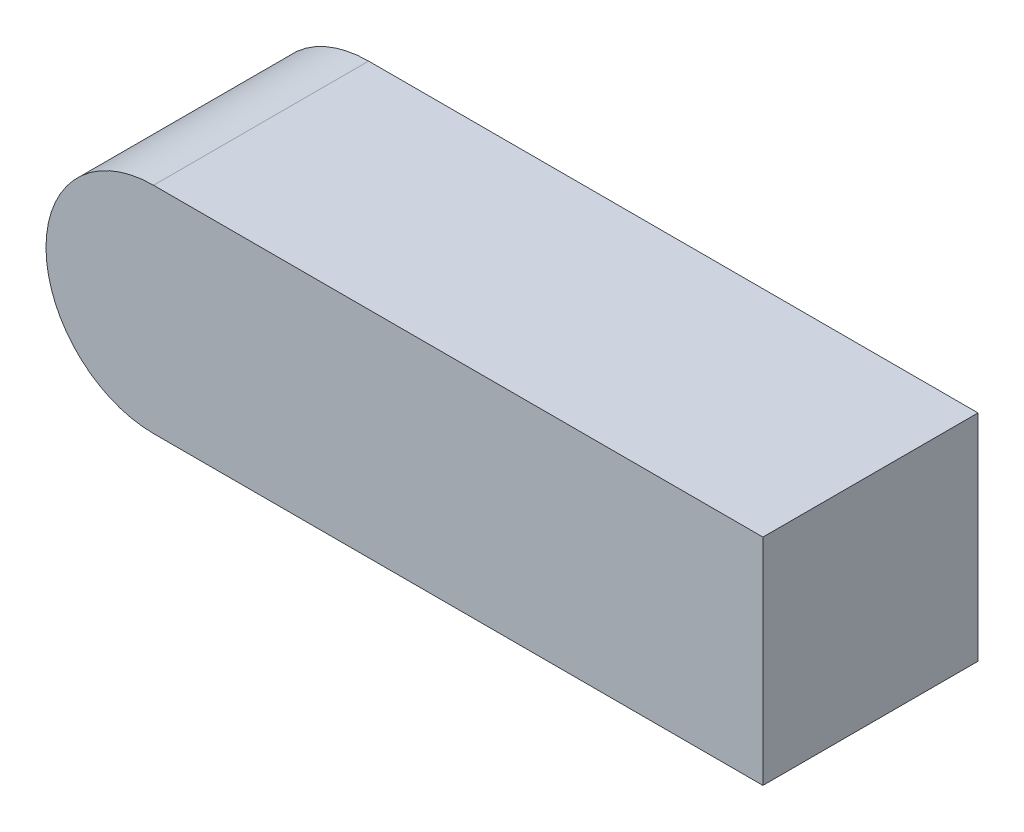
ISO-10303-21;
HEADER;
FILE_DESCRIPTION(('STEP AP214'),'2;1');
FILE_NAME('part.step','',(''),(''),'','','');
FILE_SCHEMA(('AUTOMOTIVE_DESIGN { 1 0 10303 214 1 1 1 1 }'));
ENDSEC;
DATA;
#1=APPLICATION_CONTEXT('core data for automotive mechanical design processes');
#2=APPLICATION_PROTOCOL_DEFINITION('international standard','automotive_design',2000,#1);
#3=PRODUCT_CONTEXT('',#1,'mechanical');
#4=PRODUCT('Part','Part','',(#3));
#5=PRODUCT_RELATED_PRODUCT_CATEGORY('part','',(#4));
#6=PRODUCT_DEFINITION_FORMATION('','',#4);
#7=PRODUCT_DEFINITION_CONTEXT('part definition',#1,'design');
#8=PRODUCT_DEFINITION('design','',#6,#7);
#9=PRODUCT_DEFINITION_SHAPE('','',#8);
#10=(LENGTH_UNIT() NAMED_UNIT(*) SI_UNIT(.MILLI.,.METRE.));
#11=(NAMED_UNIT(*) PLANE_ANGLE_UNIT() SI_UNIT($,.RADIAN.));
#12=(NAMED_UNIT(*) SI_UNIT($,.STERADIAN.) SOLID_ANGLE_UNIT());
#13=UNCERTAINTY_MEASURE_WITH_UNIT(LENGTH_MEASURE(1.E-05),#10,'distance_accuracy_value','');
#14=(GEOMETRIC_REPRESENTATION_CONTEXT(3) GLOBAL_UNCERTAINTY_ASSIGNED_CONTEXT((#13)) GLOBAL_UNIT_ASSIGNED_CONTEXT((#10,
#11,#12)) REPRESENTATION_CONTEXT('',''));
#15=CARTESIAN_POINT('',(0.,0.,0.));
#16=DIRECTION('',(0.,0.,1.));
#17=DIRECTION('',(1.,0.,0.));
#18=AXIS2_PLACEMENT_3D('',#15,#16,#17);
#19=CARTESIAN_POINT('',(-17.,0.,6.));
#20=DIRECTION('',(0.,0.,-1.));
#21=DIRECTION('',(-1.,0.,0.));
#22=AXIS2_PLACEMENT_3D('',#19,#20,#21);
#23=CYLINDRICAL_SURFACE('',#22,3.);
#24=CARTESIAN_POINT('',(-17.,0.,0.));
#25=DIRECTION('',(0.,0.,1.));
#26=DIRECTION('',(-1.,0.,0.));
#27=AXIS2_PLACEMENT_3D('',#24,#25,#26);
#28=CIRCLE('',#27,3.);
#29=CARTESIAN_POINT('',(-17.,3.,0.));
#30=VERTEX_POINT('',#29);
#31=CARTESIAN_POINT('',(-17.,-3.,0.));
#32=VERTEX_POINT('',#31);
#33=EDGE_CURVE('E97',#30,#32,#28,.T.);
#34=ORIENTED_EDGE('',*,*,#33,.T.);
#35=DIRECTION('',(0.,0.,-1.));
#36=VECTOR('',#35,1.);
#37=CARTESIAN_POINT('',(-17.,-3.,6.));
#38=LINE('',#37,#36);
#39=CARTESIAN_POINT('',(-17.,-3.,6.));
#40=VERTEX_POINT('',#39);
#41=EDGE_CURVE('E11',#40,#32,#38,.T.);
#42=ORIENTED_EDGE('',*,*,#41,.F.);
#43=CARTESIAN_POINT('',(-17.,0.,6.));
#44=DIRECTION('',(0.,0.,1.));
#45=DIRECTION('',(-1.,0.,0.));
#46=AXIS2_PLACEMENT_3D('',#43,#44,#45);
#47=CIRCLE('',#46,3.);
#48=CARTESIAN_POINT('',(-17.,3.,6.));
#49=VERTEX_POINT('',#48);
#50=EDGE_CURVE('E85',#49,#40,#47,.T.);
#51=ORIENTED_EDGE('',*,*,#50,.F.);
#52=DIRECTION('',(0.,0.,-1.));
#53=VECTOR('',#52,1.);
#54=CARTESIAN_POINT('',(-17.,3.,6.));
#55=LINE('',#54,#53);
#56=EDGE_CURVE('E93',#49,#30,#55,.T.);
#57=ORIENTED_EDGE('',*,*,#56,.T.);
#58=EDGE_LOOP('',(#34,#42,#51,#57));
#59=FACE_BOUND('',#58,.T.);
#60=ADVANCED_FACE('F34',(#59),#23,.T.);
#61=CARTESIAN_POINT('',(-17.,-3.,6.));
#62=DIRECTION('',(0.,1.,0.));
#63=DIRECTION('',(0.,0.,1.));
#64=AXIS2_PLACEMENT_3D('',#61,#62,#63);
#65=PLANE('',#64);
#66=DIRECTION('',(1.,0.,0.));
#67=VECTOR('',#66,1.);
#68=CARTESIAN_POINT('',(-17.,-3.,0.));
#69=LINE('',#68,#67);
#70=CARTESIAN_POINT('',(0.,-3.,0.));
#71=VERTEX_POINT('',#70);
#72=EDGE_CURVE('E89',#32,#71,#69,.T.);
#73=ORIENTED_EDGE('',*,*,#72,.T.);
#74=DIRECTION('',(0.,0.,-1.));
#75=VECTOR('',#74,1.);
#76=CARTESIAN_POINT('',(0.,-3.,6.));
#77=LINE('',#76,#75);
#78=CARTESIAN_POINT('',(0.,-3.,6.));
#79=VERTEX_POINT('',#78);
#80=EDGE_CURVE('E42',#79,#71,#77,.T.);
#81=ORIENTED_EDGE('',*,*,#80,.F.);
#82=DIRECTION('',(1.,0.,0.));
#83=VECTOR('',#82,1.);
#84=CARTESIAN_POINT('',(-17.,-3.,6.));
#85=LINE('',#84,#83);
#86=EDGE_CURVE('E80',#40,#79,#85,.T.);
#87=ORIENTED_EDGE('',*,*,#86,.F.);
#88=ORIENTED_EDGE('',*,*,#41,.T.);
#89=EDGE_LOOP('',(#73,#81,#87,#88));
#90=FACE_BOUND('',#89,.T.);
#91=ADVANCED_FACE('F88',(#90),#65,.F.);
#92=CARTESIAN_POINT('',(0.,3.,6.));
#93=DIRECTION('',(-1.,0.,0.));
#94=DIRECTION('',(0.,0.,1.));
#95=AXIS2_PLACEMENT_3D('',#92,#93,#94);
#96=PLANE('',#95);
#97=DIRECTION('',(0.,1.,0.));
#98=VECTOR('',#97,1.);
#99=CARTESIAN_POINT('',(0.,3.,0.));
#100=LINE('',#99,#98);
#101=CARTESIAN_POINT('',(0.,3.,0.));
#102=VERTEX_POINT('',#101);
#103=EDGE_CURVE('E67',#71,#102,#100,.T.);
#104=ORIENTED_EDGE('',*,*,#103,.T.);
#105=DIRECTION('',(0.,0.,-1.));
#106=VECTOR('',#105,1.);
#107=CARTESIAN_POINT('',(0.,3.,6.));
#108=LINE('',#107,#106);
#109=CARTESIAN_POINT('',(0.,3.,6.));
#110=VERTEX_POINT('',#109);
#111=EDGE_CURVE('E90',#110,#102,#108,.T.);
#112=ORIENTED_EDGE('',*,*,#111,.F.);
#113=DIRECTION('',(0.,1.,0.));
#114=VECTOR('',#113,1.);
#115=CARTESIAN_POINT('',(0.,3.,6.));
#116=LINE('',#115,#114);
#117=EDGE_CURVE('E83',#79,#110,#116,.T.);
#118=ORIENTED_EDGE('',*,*,#117,.F.);
#119=ORIENTED_EDGE('',*,*,#80,.T.);
#120=EDGE_LOOP('',(#104,#112,#118,#119));
#121=FACE_BOUND('',#120,.T.);
#122=ADVANCED_FACE('F91',(#121),#96,.F.);
#123=CARTESIAN_POINT('',(-17.,3.,6.));
#124=DIRECTION('',(0.,-1.,0.));
#125=DIRECTION('',(0.,0.,-1.));
#126=AXIS2_PLACEMENT_3D('',#123,#124,#125);
#127=PLANE('',#126);
#128=DIRECTION('',(-1.,0.,0.));
#129=VECTOR('',#128,1.);
#130=CARTESIAN_POINT('',(-17.,3.,0.));
#131=LINE('',#130,#129);
#132=EDGE_CURVE('E73',#102,#30,#131,.T.);
#133=ORIENTED_EDGE('',*,*,#132,.T.);
#134=ORIENTED_EDGE('',*,*,#56,.F.);
#135=DIRECTION('',(-1.,0.,0.));
#136=VECTOR('',#135,1.);
#137=CARTESIAN_POINT('',(-17.,3.,6.));
#138=LINE('',#137,#136);
#139=EDGE_CURVE('E50',#110,#49,#138,.T.);
#140=ORIENTED_EDGE('',*,*,#139,.F.);
#141=ORIENTED_EDGE('',*,*,#111,.T.);
#142=EDGE_LOOP('',(#133,#134,#140,#141));
#143=FACE_BOUND('',#142,.T.);
#144=ADVANCED_FACE('F104',(#143),#127,.F.);
#145=CARTESIAN_POINT('',(-17.,0.,6.));
#146=DIRECTION('',(0.,0.,-1.));
#147=DIRECTION('',(-1.,0.,0.));
#148=AXIS2_PLACEMENT_3D('',#145,#146,#147);
#149=PLANE('',#148);
#150=ORIENTED_EDGE('',*,*,#50,.T.);
#151=ORIENTED_EDGE('',*,*,#86,.T.);
#152=ORIENTED_EDGE('',*,*,#117,.T.);
#153=ORIENTED_EDGE('',*,*,#139,.T.);
#154=EDGE_LOOP('',(#150,#151,#152,#153));
#155=FACE_BOUND('',#154,.T.);
#156=ADVANCED_FACE('F81',(#155),#149,.F.);
#157=CARTESIAN_POINT('',(-17.,0.,0.));
#158=DIRECTION('',(0.,0.,-1.));
#159=DIRECTION('',(-1.,0.,0.));
#160=AXIS2_PLACEMENT_3D('',#157,#158,#159);
#161=PLANE('',#160);
#162=ORIENTED_EDGE('',*,*,#33,.F.);
#163=ORIENTED_EDGE('',*,*,#132,.F.);
#164=ORIENTED_EDGE('',*,*,#103,.F.);
#165=ORIENTED_EDGE('',*,*,#72,.F.);
#166=EDGE_LOOP('',(#162,#163,#164,#165));
#167=FACE_BOUND('',#166,.T.);
#168=ADVANCED_FACE('F107',(#167),#161,.T.);
#169=CLOSED_SHELL('',(#60,#91,#122,#144,#156,#168));
#170=MANIFOLD_SOLID_BREP('B2',#169);
#171=ADVANCED_BREP_SHAPE_REPRESENTATION('',(#18,#170),#14);
#172=SHAPE_DEFINITION_REPRESENTATION(#9,#171);
ENDSEC;
END-ISO-10303-21;
